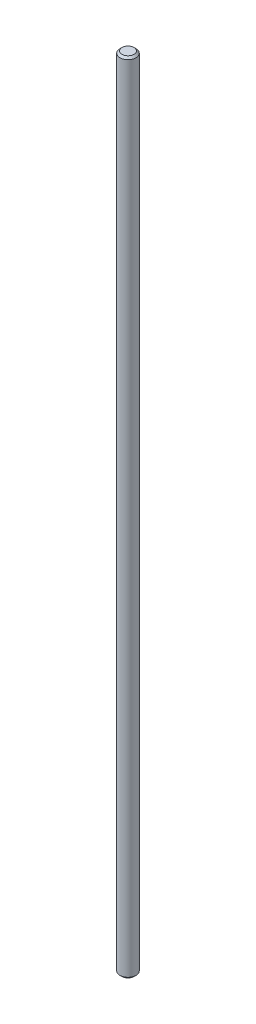
ISO-10303-21;
HEADER;
FILE_DESCRIPTION(('STEP AP214'),'2;1');
FILE_NAME('part.step','',(''),(''),'','','');
FILE_SCHEMA(('AUTOMOTIVE_DESIGN { 1 0 10303 214 1 1 1 1 }'));
ENDSEC;
DATA;
#1=APPLICATION_CONTEXT('core data for automotive mechanical design processes');
#2=APPLICATION_PROTOCOL_DEFINITION('international standard','automotive_design',2000,#1);
#3=PRODUCT_CONTEXT('',#1,'mechanical');
#4=PRODUCT('Part','Part','',(#3));
#5=PRODUCT_RELATED_PRODUCT_CATEGORY('part','',(#4));
#6=PRODUCT_DEFINITION_FORMATION('','',#4);
#7=PRODUCT_DEFINITION_CONTEXT('part definition',#1,'design');
#8=PRODUCT_DEFINITION('design','',#6,#7);
#9=PRODUCT_DEFINITION_SHAPE('','',#8);
#10=(LENGTH_UNIT() NAMED_UNIT(*) SI_UNIT(.MILLI.,.METRE.));
#11=(NAMED_UNIT(*) PLANE_ANGLE_UNIT() SI_UNIT($,.RADIAN.));
#12=(NAMED_UNIT(*) SI_UNIT($,.STERADIAN.) SOLID_ANGLE_UNIT());
#13=UNCERTAINTY_MEASURE_WITH_UNIT(LENGTH_MEASURE(1.E-05),#10,'distance_accuracy_value','');
#14=(GEOMETRIC_REPRESENTATION_CONTEXT(3) GLOBAL_UNCERTAINTY_ASSIGNED_CONTEXT((#13)) GLOBAL_UNIT_ASSIGNED_CONTEXT((#10,
#11,#12)) REPRESENTATION_CONTEXT('',''));
#15=CARTESIAN_POINT('',(0.,0.,0.));
#16=DIRECTION('',(0.,0.,1.));
#17=DIRECTION('',(1.,0.,0.));
#18=AXIS2_PLACEMENT_3D('',#15,#16,#17);
#19=CARTESIAN_POINT('',(0.,100.,0.));
#20=DIRECTION('',(0.,-1.,0.));
#21=DIRECTION('',(0.,0.,-1.));
#22=AXIS2_PLACEMENT_3D('',#19,#20,#21);
#23=CYLINDRICAL_SURFACE('',#22,2.);
#24=CARTESIAN_POINT('',(0.,-99.5,0.));
#25=DIRECTION('',(0.,1.,0.));
#26=DIRECTION('',(0.,0.,1.));
#27=AXIS2_PLACEMENT_3D('',#24,#25,#26);
#28=CIRCLE('',#27,2.);
#29=CARTESIAN_POINT('',(0.,-99.5,2.));
#30=VERTEX_POINT('',#29);
#31=EDGE_CURVE('E55',#30,#30,#28,.T.);
#32=ORIENTED_EDGE('',*,*,#31,.T.);
#33=EDGE_LOOP('',(#32));
#34=FACE_BOUND('',#33,.T.);
#35=CARTESIAN_POINT('',(0.,99.5,0.));
#36=DIRECTION('',(0.,1.,0.));
#37=DIRECTION('',(0.,0.,1.));
#38=AXIS2_PLACEMENT_3D('',#35,#36,#37);
#39=CIRCLE('',#38,2.);
#40=CARTESIAN_POINT('',(0.,99.5,2.));
#41=VERTEX_POINT('',#40);
#42=EDGE_CURVE('E59',#41,#41,#39,.F.);
#43=ORIENTED_EDGE('',*,*,#42,.T.);
#44=EDGE_LOOP('',(#43));
#45=FACE_BOUND('',#44,.T.);
#46=ADVANCED_FACE('F44',(#34,#45),#23,.T.);
#47=CARTESIAN_POINT('',(0.,100.,0.));
#48=DIRECTION('',(0.,1.,0.));
#49=DIRECTION('',(0.,0.,1.));
#50=AXIS2_PLACEMENT_3D('',#47,#48,#49);
#51=PLANE('',#50);
#52=CARTESIAN_POINT('',(0.,100.,0.));
#53=DIRECTION('',(0.,1.,0.));
#54=DIRECTION('',(0.,0.,1.));
#55=AXIS2_PLACEMENT_3D('',#52,#53,#54);
#56=CIRCLE('',#55,1.5);
#57=CARTESIAN_POINT('',(0.,100.,1.5));
#58=VERTEX_POINT('',#57);
#59=EDGE_CURVE('E12',#58,#58,#56,.T.);
#60=ORIENTED_EDGE('',*,*,#59,.T.);
#61=EDGE_LOOP('',(#60));
#62=FACE_BOUND('',#61,.T.);
#63=ADVANCED_FACE('F75',(#62),#51,.T.);
#64=CARTESIAN_POINT('',(0.,-100.,0.));
#65=DIRECTION('',(0.,1.,0.));
#66=DIRECTION('',(0.,0.,1.));
#67=AXIS2_PLACEMENT_3D('',#64,#65,#66);
#68=PLANE('',#67);
#69=CARTESIAN_POINT('',(0.,-100.,0.));
#70=DIRECTION('',(0.,1.,0.));
#71=DIRECTION('',(0.,0.,1.));
#72=AXIS2_PLACEMENT_3D('',#69,#70,#71);
#73=CIRCLE('',#72,1.49999999999995);
#74=CARTESIAN_POINT('',(0.,-100.,1.49999999999995));
#75=VERTEX_POINT('',#74);
#76=EDGE_CURVE('E51',#75,#75,#73,.F.);
#77=ORIENTED_EDGE('',*,*,#76,.T.);
#78=EDGE_LOOP('',(#77));
#79=FACE_BOUND('',#78,.T.);
#80=ADVANCED_FACE('F72',(#79),#68,.F.);
#81=CARTESIAN_POINT('',(0.,-99.5,0.));
#82=DIRECTION('',(0.,1.,0.));
#83=DIRECTION('',(0.,0.,1.));
#84=AXIS2_PLACEMENT_3D('',#81,#82,#83);
#85=CONICAL_SURFACE('',#84,2.,0.785398163397476);
#86=ORIENTED_EDGE('',*,*,#76,.F.);
#87=EDGE_LOOP('',(#86));
#88=FACE_BOUND('',#87,.T.);
#89=ORIENTED_EDGE('',*,*,#31,.F.);
#90=EDGE_LOOP('',(#89));
#91=FACE_BOUND('',#90,.T.);
#92=ADVANCED_FACE('F68',(#88,#91),#85,.T.);
#93=CARTESIAN_POINT('',(0.,100.,0.));
#94=DIRECTION('',(0.,-1.,0.));
#95=DIRECTION('',(0.,0.,-1.));
#96=AXIS2_PLACEMENT_3D('',#93,#94,#95);
#97=CONICAL_SURFACE('',#96,1.5,0.785398163397448);
#98=ORIENTED_EDGE('',*,*,#42,.F.);
#99=EDGE_LOOP('',(#98));
#100=FACE_BOUND('',#99,.T.);
#101=ORIENTED_EDGE('',*,*,#59,.F.);
#102=EDGE_LOOP('',(#101));
#103=FACE_BOUND('',#102,.T.);
#104=ADVANCED_FACE('F46',(#100,#103),#97,.T.);
#105=CLOSED_SHELL('',(#46,#63,#80,#92,#104));
#106=MANIFOLD_SOLID_BREP('B2',#105);
#107=ADVANCED_BREP_SHAPE_REPRESENTATION('',(#18,#106),#14);
#108=SHAPE_DEFINITION_REPRESENTATION(#9,#107);
ENDSEC;
END-ISO-10303-21;
